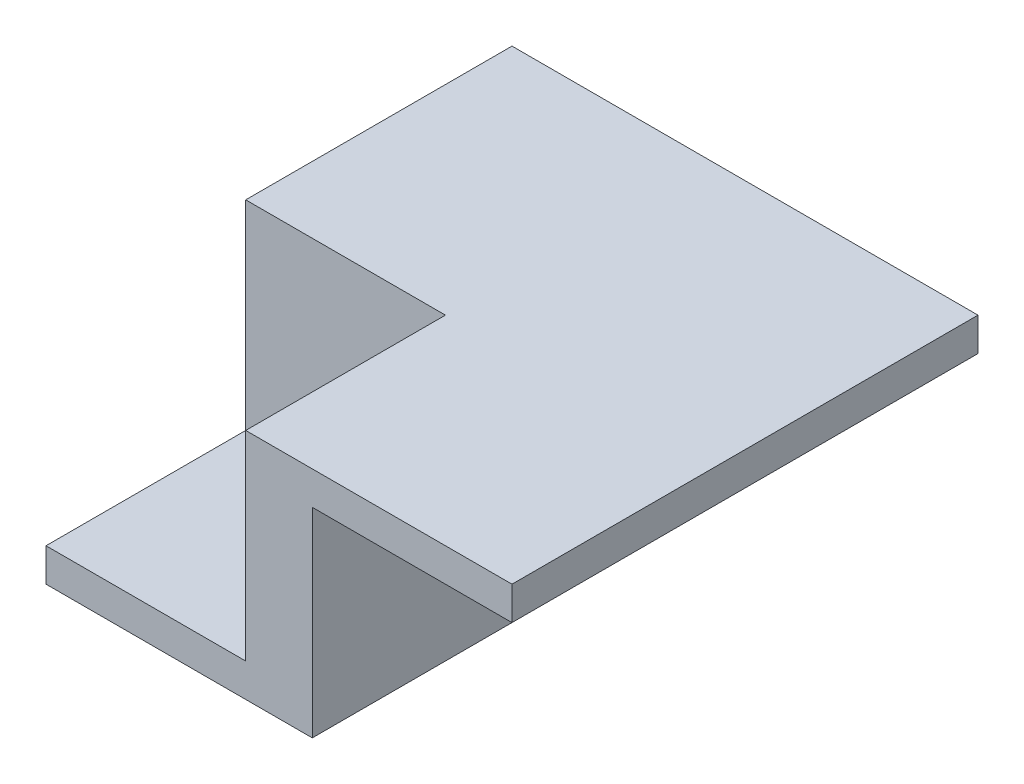
ISO-10303-21;
HEADER;
FILE_DESCRIPTION(('STEP AP214'),'2;1');
FILE_NAME('part.step','',(''),(''),'','','');
FILE_SCHEMA(('AUTOMOTIVE_DESIGN { 1 0 10303 214 1 1 1 1 }'));
ENDSEC;
DATA;
#1=APPLICATION_CONTEXT('core data for automotive mechanical design processes');
#2=APPLICATION_PROTOCOL_DEFINITION('international standard','automotive_design',2000,#1);
#3=PRODUCT_CONTEXT('',#1,'mechanical');
#4=PRODUCT('Part','Part','',(#3));
#5=PRODUCT_RELATED_PRODUCT_CATEGORY('part','',(#4));
#6=PRODUCT_DEFINITION_FORMATION('','',#4);
#7=PRODUCT_DEFINITION_CONTEXT('part definition',#1,'design');
#8=PRODUCT_DEFINITION('design','',#6,#7);
#9=PRODUCT_DEFINITION_SHAPE('','',#8);
#10=(LENGTH_UNIT() NAMED_UNIT(*) SI_UNIT(.MILLI.,.METRE.));
#11=(NAMED_UNIT(*) PLANE_ANGLE_UNIT() SI_UNIT($,.RADIAN.));
#12=(NAMED_UNIT(*) SI_UNIT($,.STERADIAN.) SOLID_ANGLE_UNIT());
#13=UNCERTAINTY_MEASURE_WITH_UNIT(LENGTH_MEASURE(1.E-05),#10,'distance_accuracy_value','');
#14=(GEOMETRIC_REPRESENTATION_CONTEXT(3) GLOBAL_UNCERTAINTY_ASSIGNED_CONTEXT((#13)) GLOBAL_UNIT_ASSIGNED_CONTEXT((#10,
#11,#12)) REPRESENTATION_CONTEXT('',''));
#15=CARTESIAN_POINT('',(0.,0.,0.));
#16=DIRECTION('',(0.,0.,1.));
#17=DIRECTION('',(1.,0.,0.));
#18=AXIS2_PLACEMENT_3D('',#15,#16,#17);
#19=CARTESIAN_POINT('',(5.,-17.5,5.));
#20=DIRECTION('',(-1.,0.,0.));
#21=DIRECTION('',(0.,-1.,0.));
#22=AXIS2_PLACEMENT_3D('',#19,#20,#21);
#23=PLANE('',#22);
#24=DIRECTION('',(0.,0.,-1.));
#25=VECTOR('',#24,1.);
#26=CARTESIAN_POINT('',(5.,12.5,5.));
#27=LINE('',#26,#25);
#28=CARTESIAN_POINT('',(5.,12.5,35.));
#29=VERTEX_POINT('',#28);
#30=CARTESIAN_POINT('',(5.00000000000002,12.5,-4.99999999999998));
#31=VERTEX_POINT('',#30);
#32=EDGE_CURVE('E221',#29,#31,#27,.T.);
#33=ORIENTED_EDGE('',*,*,#32,.F.);
#34=DIRECTION('',(0.,-1.,0.));
#35=VECTOR('',#34,1.);
#36=CARTESIAN_POINT('',(4.9999999999999,-12.5,35.));
#37=LINE('',#36,#35);
#38=CARTESIAN_POINT('',(4.9999999999999,-17.5,35.));
#39=VERTEX_POINT('',#38);
#40=EDGE_CURVE('E185',#29,#39,#37,.T.);
#41=ORIENTED_EDGE('',*,*,#40,.T.);
#42=DIRECTION('',(0.,0.,-1.));
#43=VECTOR('',#42,1.);
#44=CARTESIAN_POINT('',(5.,-17.5,5.));
#45=LINE('',#44,#43);
#46=CARTESIAN_POINT('',(5.,-17.5,-5.));
#47=VERTEX_POINT('',#46);
#48=EDGE_CURVE('E224',#39,#47,#45,.T.);
#49=ORIENTED_EDGE('',*,*,#48,.T.);
#50=DIRECTION('',(0.,1.,0.));
#51=VECTOR('',#50,1.);
#52=CARTESIAN_POINT('',(5.,-17.5,-5.));
#53=LINE('',#52,#51);
#54=EDGE_CURVE('E207',#47,#31,#53,.T.);
#55=ORIENTED_EDGE('',*,*,#54,.T.);
#56=EDGE_LOOP('',(#33,#41,#49,#55));
#57=FACE_BOUND('',#56,.T.);
#58=ADVANCED_FACE('F42',(#57),#23,.F.);
#59=CARTESIAN_POINT('',(-5.,-12.5,5.));
#60=DIRECTION('',(0.,-1.,0.));
#61=DIRECTION('',(1.,0.,0.));
#62=AXIS2_PLACEMENT_3D('',#59,#60,#61);
#63=PLANE('',#62);
#64=DIRECTION('',(0.,0.,1.));
#65=VECTOR('',#64,1.);
#66=CARTESIAN_POINT('',(-5.,-12.5,35.));
#67=LINE('',#66,#65);
#68=CARTESIAN_POINT('',(-5.,-12.5,4.99999999999999));
#69=VERTEX_POINT('',#68);
#70=CARTESIAN_POINT('',(-5.,-12.5,35.));
#71=VERTEX_POINT('',#70);
#72=EDGE_CURVE('E58',#69,#71,#67,.T.);
#73=ORIENTED_EDGE('',*,*,#72,.F.);
#74=DIRECTION('',(1.,0.,0.));
#75=VECTOR('',#74,1.);
#76=CARTESIAN_POINT('',(-5.00000000000002,-12.5,4.99999999999999));
#77=LINE('',#76,#75);
#78=CARTESIAN_POINT('',(-35.,-12.5,5.00000000000001));
#79=VERTEX_POINT('',#78);
#80=EDGE_CURVE('E188',#79,#69,#77,.T.);
#81=ORIENTED_EDGE('',*,*,#80,.F.);
#82=DIRECTION('',(0.,0.,-1.));
#83=VECTOR('',#82,1.);
#84=CARTESIAN_POINT('',(-35.,-12.5,5.));
#85=LINE('',#84,#83);
#86=CARTESIAN_POINT('',(-35.,-12.5,34.9999999999999));
#87=VERTEX_POINT('',#86);
#88=EDGE_CURVE('E11',#87,#79,#85,.T.);
#89=ORIENTED_EDGE('',*,*,#88,.F.);
#90=DIRECTION('',(1.,0.,0.));
#91=VECTOR('',#90,1.);
#92=CARTESIAN_POINT('',(-5.0000000000001,-12.5,35.));
#93=LINE('',#92,#91);
#94=EDGE_CURVE('E191',#87,#71,#93,.T.);
#95=ORIENTED_EDGE('',*,*,#94,.T.);
#96=EDGE_LOOP('',(#73,#81,#89,#95));
#97=FACE_BOUND('',#96,.T.);
#98=ADVANCED_FACE('F44',(#97),#63,.F.);
#99=CARTESIAN_POINT('',(0.,0.,5.));
#100=DIRECTION('',(0.,0.,-1.));
#101=DIRECTION('',(-1.,0.,0.));
#102=AXIS2_PLACEMENT_3D('',#99,#100,#101);
#103=PLANE('',#102);
#104=DIRECTION('',(0.,-1.,0.));
#105=VECTOR('',#104,1.);
#106=CARTESIAN_POINT('',(-5.,-12.5,5.00000000000002));
#107=LINE('',#106,#105);
#108=CARTESIAN_POINT('',(-5.,17.5,5.));
#109=VERTEX_POINT('',#108);
#110=EDGE_CURVE('E65',#109,#69,#107,.T.);
#111=ORIENTED_EDGE('',*,*,#110,.F.);
#112=DIRECTION('',(-1.,0.,0.));
#113=VECTOR('',#112,1.);
#114=CARTESIAN_POINT('',(0.,17.5,5.));
#115=LINE('',#114,#113);
#116=CARTESIAN_POINT('',(-35.,17.5,5.));
#117=VERTEX_POINT('',#116);
#118=EDGE_CURVE('E204',#109,#117,#115,.T.);
#119=ORIENTED_EDGE('',*,*,#118,.T.);
#120=DIRECTION('',(0.,-1.,0.));
#121=VECTOR('',#120,1.);
#122=CARTESIAN_POINT('',(-35.,-12.5,5.));
#123=LINE('',#122,#121);
#124=EDGE_CURVE('E128',#117,#79,#123,.T.);
#125=ORIENTED_EDGE('',*,*,#124,.T.);
#126=ORIENTED_EDGE('',*,*,#80,.T.);
#127=EDGE_LOOP('',(#111,#119,#125,#126));
#128=FACE_BOUND('',#127,.T.);
#129=ADVANCED_FACE('F269',(#128),#103,.F.);
#130=CARTESIAN_POINT('',(0.,0.,-5.));
#131=DIRECTION('',(0.,0.,-1.));
#132=DIRECTION('',(-1.,0.,0.));
#133=AXIS2_PLACEMENT_3D('',#130,#131,#132);
#134=PLANE('',#133);
#135=DIRECTION('',(0.,-1.,0.));
#136=VECTOR('',#135,1.);
#137=CARTESIAN_POINT('',(-35.,-12.5,-5.));
#138=LINE('',#137,#136);
#139=CARTESIAN_POINT('',(-35.,12.5,-5.));
#140=VERTEX_POINT('',#139);
#141=CARTESIAN_POINT('',(-35.,-17.5,-5.));
#142=VERTEX_POINT('',#141);
#143=EDGE_CURVE('E141',#140,#142,#138,.T.);
#144=ORIENTED_EDGE('',*,*,#143,.F.);
#145=DIRECTION('',(1.,0.,0.));
#146=VECTOR('',#145,1.);
#147=CARTESIAN_POINT('',(-4.99999999999999,12.5,-5.00000000000001));
#148=LINE('',#147,#146);
#149=EDGE_CURVE('E198',#140,#31,#148,.T.);
#150=ORIENTED_EDGE('',*,*,#149,.T.);
#151=ORIENTED_EDGE('',*,*,#54,.F.);
#152=DIRECTION('',(1.,0.,0.));
#153=VECTOR('',#152,1.);
#154=CARTESIAN_POINT('',(0.,-17.5,-5.));
#155=LINE('',#154,#153);
#156=EDGE_CURVE('E210',#142,#47,#155,.T.);
#157=ORIENTED_EDGE('',*,*,#156,.F.);
#158=EDGE_LOOP('',(#144,#150,#151,#157));
#159=FACE_BOUND('',#158,.T.);
#160=ADVANCED_FACE('F239',(#159),#134,.T.);
#161=CARTESIAN_POINT('',(-35.,-12.5,5.));
#162=DIRECTION('',(1.,0.,0.));
#163=DIRECTION('',(0.,1.,0.));
#164=AXIS2_PLACEMENT_3D('',#161,#162,#163);
#165=PLANE('',#164);
#166=DIRECTION('',(0.,0.,-1.));
#167=VECTOR('',#166,1.);
#168=CARTESIAN_POINT('',(-35.,17.5,47.4264068711928));
#169=LINE('',#168,#167);
#170=CARTESIAN_POINT('',(-35.,17.5,-35.));
#171=VERTEX_POINT('',#170);
#172=EDGE_CURVE('E121',#117,#171,#169,.T.);
#173=ORIENTED_EDGE('',*,*,#172,.T.);
#174=DIRECTION('',(0.,-1.,0.));
#175=VECTOR('',#174,1.);
#176=CARTESIAN_POINT('',(-34.9999999999999,17.5,-35.));
#177=LINE('',#176,#175);
#178=CARTESIAN_POINT('',(-35.,12.5,-35.));
#179=VERTEX_POINT('',#178);
#180=EDGE_CURVE('E126',#171,#179,#177,.T.);
#181=ORIENTED_EDGE('',*,*,#180,.T.);
#182=DIRECTION('',(0.,0.,1.));
#183=VECTOR('',#182,1.);
#184=CARTESIAN_POINT('',(-35.,12.5,-5.00000000000001));
#185=LINE('',#184,#183);
#186=EDGE_CURVE('E148',#179,#140,#185,.T.);
#187=ORIENTED_EDGE('',*,*,#186,.T.);
#188=ORIENTED_EDGE('',*,*,#143,.T.);
#189=DIRECTION('',(0.,0.,-1.));
#190=VECTOR('',#189,1.);
#191=CARTESIAN_POINT('',(-35.,-17.5,5.));
#192=LINE('',#191,#190);
#193=CARTESIAN_POINT('',(-35.,-17.5,34.9999999999999));
#194=VERTEX_POINT('',#193);
#195=EDGE_CURVE('E51',#194,#142,#192,.T.);
#196=ORIENTED_EDGE('',*,*,#195,.F.);
#197=DIRECTION('',(0.,-1.,0.));
#198=VECTOR('',#197,1.);
#199=CARTESIAN_POINT('',(-35.,-12.5,34.9999999999999));
#200=LINE('',#199,#198);
#201=EDGE_CURVE('E181',#87,#194,#200,.T.);
#202=ORIENTED_EDGE('',*,*,#201,.F.);
#203=ORIENTED_EDGE('',*,*,#88,.T.);
#204=ORIENTED_EDGE('',*,*,#124,.F.);
#205=EDGE_LOOP('',(#173,#181,#187,#188,#196,#202,#203,#204));
#206=FACE_BOUND('',#205,.T.);
#207=ADVANCED_FACE('F123',(#206),#165,.F.);
#208=CARTESIAN_POINT('',(0.,-17.5,5.));
#209=DIRECTION('',(0.,1.,0.));
#210=DIRECTION('',(0.,0.,1.));
#211=AXIS2_PLACEMENT_3D('',#208,#209,#210);
#212=PLANE('',#211);
#213=ORIENTED_EDGE('',*,*,#48,.F.);
#214=DIRECTION('',(1.,0.,0.));
#215=VECTOR('',#214,1.);
#216=CARTESIAN_POINT('',(-5.0000000000001,-17.5,35.));
#217=LINE('',#216,#215);
#218=EDGE_CURVE('E194',#194,#39,#217,.T.);
#219=ORIENTED_EDGE('',*,*,#218,.F.);
#220=ORIENTED_EDGE('',*,*,#195,.T.);
#221=ORIENTED_EDGE('',*,*,#156,.T.);
#222=EDGE_LOOP('',(#213,#219,#220,#221));
#223=FACE_BOUND('',#222,.T.);
#224=ADVANCED_FACE('F233',(#223),#212,.F.);
#225=CARTESIAN_POINT('',(5.,12.5,5.));
#226=DIRECTION('',(0.,1.,0.));
#227=DIRECTION('',(-1.,0.,0.));
#228=AXIS2_PLACEMENT_3D('',#225,#226,#227);
#229=PLANE('',#228);
#230=ORIENTED_EDGE('',*,*,#32,.T.);
#231=ORIENTED_EDGE('',*,*,#149,.F.);
#232=ORIENTED_EDGE('',*,*,#186,.F.);
#233=DIRECTION('',(1.,0.,0.));
#234=VECTOR('',#233,1.);
#235=CARTESIAN_POINT('',(-4.9999999999999,12.5,-35.));
#236=LINE('',#235,#234);
#237=CARTESIAN_POINT('',(35.,12.5,-34.9999999999999));
#238=VERTEX_POINT('',#237);
#239=EDGE_CURVE('E142',#179,#238,#236,.T.);
#240=ORIENTED_EDGE('',*,*,#239,.T.);
#241=DIRECTION('',(0.,0.,-1.));
#242=VECTOR('',#241,1.);
#243=CARTESIAN_POINT('',(35.,12.5,5.));
#244=LINE('',#243,#242);
#245=CARTESIAN_POINT('',(35.,12.5,35.));
#246=VERTEX_POINT('',#245);
#247=EDGE_CURVE('E218',#246,#238,#244,.T.);
#248=ORIENTED_EDGE('',*,*,#247,.F.);
#249=DIRECTION('',(1.,0.,0.));
#250=VECTOR('',#249,1.);
#251=CARTESIAN_POINT('',(5.,12.5,35.));
#252=LINE('',#251,#250);
#253=EDGE_CURVE('E155',#29,#246,#252,.T.);
#254=ORIENTED_EDGE('',*,*,#253,.F.);
#255=EDGE_LOOP('',(#230,#231,#232,#240,#248,#254));
#256=FACE_BOUND('',#255,.T.);
#257=ADVANCED_FACE('F255',(#256),#229,.F.);
#258=CARTESIAN_POINT('',(35.,17.5,5.));
#259=DIRECTION('',(-1.,0.,0.));
#260=DIRECTION('',(0.,0.,1.));
#261=AXIS2_PLACEMENT_3D('',#258,#259,#260);
#262=PLANE('',#261);
#263=ORIENTED_EDGE('',*,*,#247,.T.);
#264=DIRECTION('',(0.,-1.,0.));
#265=VECTOR('',#264,1.);
#266=CARTESIAN_POINT('',(35.,17.5,-34.9999999999999));
#267=LINE('',#266,#265);
#268=CARTESIAN_POINT('',(35.,17.5,-34.9999999999999));
#269=VERTEX_POINT('',#268);
#270=EDGE_CURVE('E177',#269,#238,#267,.T.);
#271=ORIENTED_EDGE('',*,*,#270,.F.);
#272=DIRECTION('',(0.,0.,-1.));
#273=VECTOR('',#272,1.);
#274=CARTESIAN_POINT('',(35.,17.5,5.));
#275=LINE('',#274,#273);
#276=CARTESIAN_POINT('',(35.,17.5,35.));
#277=VERTEX_POINT('',#276);
#278=EDGE_CURVE('E136',#277,#269,#275,.T.);
#279=ORIENTED_EDGE('',*,*,#278,.F.);
#280=DIRECTION('',(0.,1.,0.));
#281=VECTOR('',#280,1.);
#282=CARTESIAN_POINT('',(35.,17.5,35.));
#283=LINE('',#282,#281);
#284=EDGE_CURVE('E152',#246,#277,#283,.T.);
#285=ORIENTED_EDGE('',*,*,#284,.F.);
#286=EDGE_LOOP('',(#263,#271,#279,#285));
#287=FACE_BOUND('',#286,.T.);
#288=ADVANCED_FACE('F253',(#287),#262,.F.);
#289=CARTESIAN_POINT('',(0.,17.5,5.));
#290=DIRECTION('',(0.,-1.,0.));
#291=DIRECTION('',(0.,0.,-1.));
#292=AXIS2_PLACEMENT_3D('',#289,#290,#291);
#293=PLANE('',#292);
#294=ORIENTED_EDGE('',*,*,#278,.T.);
#295=DIRECTION('',(1.,0.,0.));
#296=VECTOR('',#295,1.);
#297=CARTESIAN_POINT('',(-4.9999999999999,17.5,-35.));
#298=LINE('',#297,#296);
#299=EDGE_CURVE('E133',#171,#269,#298,.T.);
#300=ORIENTED_EDGE('',*,*,#299,.F.);
#301=ORIENTED_EDGE('',*,*,#172,.F.);
#302=ORIENTED_EDGE('',*,*,#118,.F.);
#303=DIRECTION('',(0.,0.,-1.));
#304=VECTOR('',#303,1.);
#305=CARTESIAN_POINT('',(-5.,17.5,35.));
#306=LINE('',#305,#304);
#307=CARTESIAN_POINT('',(-5.,17.5,35.));
#308=VERTEX_POINT('',#307);
#309=EDGE_CURVE('E165',#308,#109,#306,.T.);
#310=ORIENTED_EDGE('',*,*,#309,.F.);
#311=DIRECTION('',(1.,0.,0.));
#312=VECTOR('',#311,1.);
#313=CARTESIAN_POINT('',(-47.4264068711928,17.5,35.));
#314=LINE('',#313,#312);
#315=EDGE_CURVE('E159',#308,#277,#314,.T.);
#316=ORIENTED_EDGE('',*,*,#315,.T.);
#317=EDGE_LOOP('',(#294,#300,#301,#302,#310,#316));
#318=FACE_BOUND('',#317,.T.);
#319=ADVANCED_FACE('F134',(#318),#293,.F.);
#320=CARTESIAN_POINT('',(-4.9999999999999,17.5,-35.));
#321=DIRECTION('',(0.,0.,-1.));
#322=DIRECTION('',(-1.,0.,0.));
#323=AXIS2_PLACEMENT_3D('',#320,#321,#322);
#324=PLANE('',#323);
#325=ORIENTED_EDGE('',*,*,#299,.T.);
#326=ORIENTED_EDGE('',*,*,#270,.T.);
#327=ORIENTED_EDGE('',*,*,#239,.F.);
#328=ORIENTED_EDGE('',*,*,#180,.F.);
#329=EDGE_LOOP('',(#325,#326,#327,#328));
#330=FACE_BOUND('',#329,.T.);
#331=ADVANCED_FACE('F144',(#330),#324,.T.);
#332=CARTESIAN_POINT('',(-5.0000000000001,-12.5,35.));
#333=DIRECTION('',(0.,0.,1.));
#334=DIRECTION('',(1.,0.,0.));
#335=AXIS2_PLACEMENT_3D('',#332,#333,#334);
#336=PLANE('',#335);
#337=ORIENTED_EDGE('',*,*,#40,.F.);
#338=ORIENTED_EDGE('',*,*,#253,.T.);
#339=ORIENTED_EDGE('',*,*,#284,.T.);
#340=ORIENTED_EDGE('',*,*,#315,.F.);
#341=DIRECTION('',(0.,1.,0.));
#342=VECTOR('',#341,1.);
#343=CARTESIAN_POINT('',(-5.,-12.5,35.));
#344=LINE('',#343,#342);
#345=EDGE_CURVE('E169',#71,#308,#344,.T.);
#346=ORIENTED_EDGE('',*,*,#345,.F.);
#347=ORIENTED_EDGE('',*,*,#94,.F.);
#348=ORIENTED_EDGE('',*,*,#201,.T.);
#349=ORIENTED_EDGE('',*,*,#218,.T.);
#350=EDGE_LOOP('',(#337,#338,#339,#340,#346,#347,#348,#349));
#351=FACE_BOUND('',#350,.T.);
#352=ADVANCED_FACE('F243',(#351),#336,.T.);
#353=CARTESIAN_POINT('',(-5.,17.5,5.));
#354=DIRECTION('',(1.,0.,0.));
#355=DIRECTION('',(0.,0.,-1.));
#356=AXIS2_PLACEMENT_3D('',#353,#354,#355);
#357=PLANE('',#356);
#358=ORIENTED_EDGE('',*,*,#345,.T.);
#359=ORIENTED_EDGE('',*,*,#309,.T.);
#360=ORIENTED_EDGE('',*,*,#110,.T.);
#361=ORIENTED_EDGE('',*,*,#72,.T.);
#362=EDGE_LOOP('',(#358,#359,#360,#361));
#363=FACE_BOUND('',#362,.T.);
#364=ADVANCED_FACE('F249',(#363),#357,.F.);
#365=CLOSED_SHELL('',(#58,#98,#129,#160,#207,#224,#257,#288,#319,#331,#352,#364));
#366=MANIFOLD_SOLID_BREP('B2',#365);
#367=ADVANCED_BREP_SHAPE_REPRESENTATION('',(#18,#366),#14);
#368=SHAPE_DEFINITION_REPRESENTATION(#9,#367);
ENDSEC;
END-ISO-10303-21;
